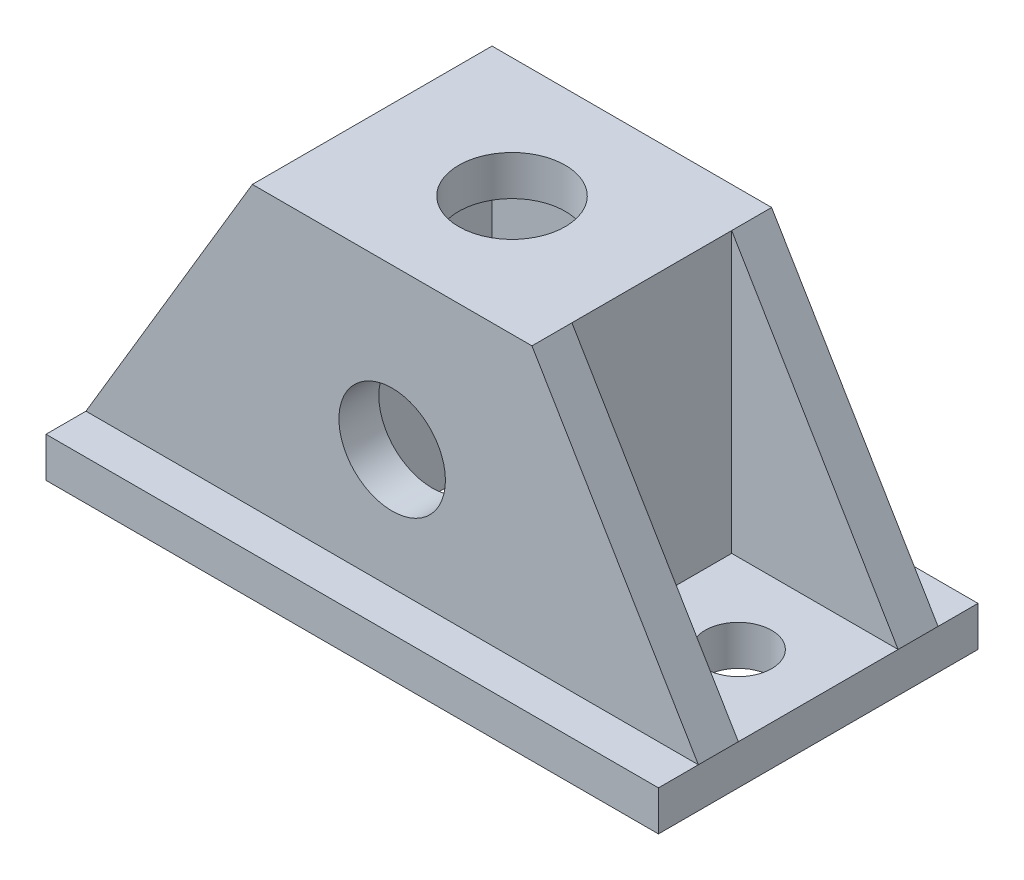
ISO-10303-21;
HEADER;
FILE_DESCRIPTION(('STEP AP214'),'2;1');
FILE_NAME('part.step','',(''),(''),'','','');
FILE_SCHEMA(('AUTOMOTIVE_DESIGN { 1 0 10303 214 1 1 1 1 }'));
ENDSEC;
DATA;
#1=APPLICATION_CONTEXT('core data for automotive mechanical design processes');
#2=APPLICATION_PROTOCOL_DEFINITION('international standard','automotive_design',2000,#1);
#3=PRODUCT_CONTEXT('',#1,'mechanical');
#4=PRODUCT('Part','Part','',(#3));
#5=PRODUCT_RELATED_PRODUCT_CATEGORY('part','',(#4));
#6=PRODUCT_DEFINITION_FORMATION('','',#4);
#7=PRODUCT_DEFINITION_CONTEXT('part definition',#1,'design');
#8=PRODUCT_DEFINITION('design','',#6,#7);
#9=PRODUCT_DEFINITION_SHAPE('','',#8);
#10=(LENGTH_UNIT() NAMED_UNIT(*) SI_UNIT(.MILLI.,.METRE.));
#11=(NAMED_UNIT(*) PLANE_ANGLE_UNIT() SI_UNIT($,.RADIAN.));
#12=(NAMED_UNIT(*) SI_UNIT($,.STERADIAN.) SOLID_ANGLE_UNIT());
#13=UNCERTAINTY_MEASURE_WITH_UNIT(LENGTH_MEASURE(1.E-05),#10,'distance_accuracy_value','');
#14=(GEOMETRIC_REPRESENTATION_CONTEXT(3) GLOBAL_UNCERTAINTY_ASSIGNED_CONTEXT((#13)) GLOBAL_UNIT_ASSIGNED_CONTEXT((#10,
#11,#12)) REPRESENTATION_CONTEXT('',''));
#15=CARTESIAN_POINT('',(0.,0.,0.));
#16=DIRECTION('',(0.,0.,1.));
#17=DIRECTION('',(1.,0.,0.));
#18=AXIS2_PLACEMENT_3D('',#15,#16,#17);
#19=CARTESIAN_POINT('',(-21.,42.,18.));
#20=DIRECTION('',(0.,0.,-1.));
#21=DIRECTION('',(-1.,0.,0.));
#22=AXIS2_PLACEMENT_3D('',#19,#20,#21);
#23=PLANE('',#22);
#24=DIRECTION('',(1.,0.,0.));
#25=VECTOR('',#24,1.);
#26=CARTESIAN_POINT('',(-21.,6.,18.));
#27=LINE('',#26,#25);
#28=CARTESIAN_POINT('',(-46.,6.,18.));
#29=VERTEX_POINT('',#28);
#30=CARTESIAN_POINT('',(46.,6.,18.));
#31=VERTEX_POINT('',#30);
#32=EDGE_CURVE('E223',#29,#31,#27,.T.);
#33=ORIENTED_EDGE('',*,*,#32,.T.);
#34=DIRECTION('',(-0.511483859767683,0.859292884409707,0.));
#35=VECTOR('',#34,1.);
#36=CARTESIAN_POINT('',(21.,48.,18.));
#37=LINE('',#36,#35);
#38=CARTESIAN_POINT('',(21.,48.,18.));
#39=VERTEX_POINT('',#38);
#40=EDGE_CURVE('E329',#31,#39,#37,.T.);
#41=ORIENTED_EDGE('',*,*,#40,.T.);
#42=DIRECTION('',(1.,0.,0.));
#43=VECTOR('',#42,1.);
#44=CARTESIAN_POINT('',(-21.,48.,18.));
#45=LINE('',#44,#43);
#46=CARTESIAN_POINT('',(-21.,48.,18.));
#47=VERTEX_POINT('',#46);
#48=EDGE_CURVE('E197',#47,#39,#45,.T.);
#49=ORIENTED_EDGE('',*,*,#48,.F.);
#50=DIRECTION('',(-0.511483859767683,-0.859292884409707,0.));
#51=VECTOR('',#50,1.);
#52=CARTESIAN_POINT('',(-21.,48.,18.));
#53=LINE('',#52,#51);
#54=EDGE_CURVE('E332',#47,#29,#53,.T.);
#55=ORIENTED_EDGE('',*,*,#54,.T.);
#56=EDGE_LOOP('',(#33,#41,#49,#55));
#57=FACE_BOUND('',#56,.T.);
#58=CARTESIAN_POINT('',(0.,24.,18.));
#59=DIRECTION('',(0.,0.,1.));
#60=DIRECTION('',(1.,0.,0.));
#61=AXIS2_PLACEMENT_3D('',#58,#59,#60);
#62=CIRCLE('',#61,8.);
#63=CARTESIAN_POINT('',(8.,24.,18.));
#64=VERTEX_POINT('',#63);
#65=EDGE_CURVE('E481',#64,#64,#62,.T.);
#66=ORIENTED_EDGE('',*,*,#65,.F.);
#67=EDGE_LOOP('',(#66));
#68=FACE_BOUND('',#67,.T.);
#69=ADVANCED_FACE('F37',(#57,#68),#23,.F.);
#70=CARTESIAN_POINT('',(0.,6.,0.));
#71=DIRECTION('',(0.,1.,0.));
#72=DIRECTION('',(0.,0.,1.));
#73=AXIS2_PLACEMENT_3D('',#70,#71,#72);
#74=PLANE('',#73);
#75=CARTESIAN_POINT('',(34.,6.,0.));
#76=DIRECTION('',(0.,1.,0.));
#77=DIRECTION('',(0.,0.,1.));
#78=AXIS2_PLACEMENT_3D('',#75,#76,#77);
#79=CIRCLE('',#78,5.);
#80=CARTESIAN_POINT('',(34.,6.,5.));
#81=VERTEX_POINT('',#80);
#82=EDGE_CURVE('E467',#81,#81,#79,.T.);
#83=ORIENTED_EDGE('',*,*,#82,.F.);
#84=EDGE_LOOP('',(#83));
#85=FACE_BOUND('',#84,.T.);
#86=DIRECTION('',(0.,0.,-1.));
#87=VECTOR('',#86,1.);
#88=CARTESIAN_POINT('',(46.,6.,-24.));
#89=LINE('',#88,#87);
#90=CARTESIAN_POINT('',(46.,6.,12.));
#91=VERTEX_POINT('',#90);
#92=CARTESIAN_POINT('',(46.,6.,-12.));
#93=VERTEX_POINT('',#92);
#94=EDGE_CURVE('E263',#91,#93,#89,.T.);
#95=ORIENTED_EDGE('',*,*,#94,.T.);
#96=DIRECTION('',(1.,0.,0.));
#97=VECTOR('',#96,1.);
#98=CARTESIAN_POINT('',(46.,6.,-12.));
#99=LINE('',#98,#97);
#100=CARTESIAN_POINT('',(21.,6.,-12.));
#101=VERTEX_POINT('',#100);
#102=EDGE_CURVE('E168',#101,#93,#99,.T.);
#103=ORIENTED_EDGE('',*,*,#102,.F.);
#104=DIRECTION('',(0.,0.,-1.));
#105=VECTOR('',#104,1.);
#106=CARTESIAN_POINT('',(21.,6.,-18.));
#107=LINE('',#106,#105);
#108=CARTESIAN_POINT('',(21.,6.,12.));
#109=VERTEX_POINT('',#108);
#110=EDGE_CURVE('E192',#109,#101,#107,.T.);
#111=ORIENTED_EDGE('',*,*,#110,.F.);
#112=DIRECTION('',(1.,0.,0.));
#113=VECTOR('',#112,1.);
#114=CARTESIAN_POINT('',(46.,6.,12.));
#115=LINE('',#114,#113);
#116=EDGE_CURVE('E313',#109,#91,#115,.T.);
#117=ORIENTED_EDGE('',*,*,#116,.T.);
#118=EDGE_LOOP('',(#95,#103,#111,#117));
#119=FACE_BOUND('',#118,.T.);
#120=ADVANCED_FACE('F312',(#85,#119),#74,.T.);
#121=CARTESIAN_POINT('',(21.,42.,-18.));
#122=DIRECTION('',(-1.,0.,0.));
#123=DIRECTION('',(0.,0.,1.));
#124=AXIS2_PLACEMENT_3D('',#121,#122,#123);
#125=PLANE('',#124);
#126=DIRECTION('',(0.,-1.,0.));
#127=VECTOR('',#126,1.);
#128=CARTESIAN_POINT('',(21.,6.,-12.));
#129=LINE('',#128,#127);
#130=CARTESIAN_POINT('',(21.,48.,-12.));
#131=VERTEX_POINT('',#130);
#132=EDGE_CURVE('E166',#131,#101,#129,.T.);
#133=ORIENTED_EDGE('',*,*,#132,.F.);
#134=DIRECTION('',(0.,0.,-1.));
#135=VECTOR('',#134,1.);
#136=CARTESIAN_POINT('',(21.,48.,18.));
#137=LINE('',#136,#135);
#138=CARTESIAN_POINT('',(21.,48.,12.));
#139=VERTEX_POINT('',#138);
#140=EDGE_CURVE('E189',#139,#131,#137,.T.);
#141=ORIENTED_EDGE('',*,*,#140,.F.);
#142=DIRECTION('',(0.,-1.,0.));
#143=VECTOR('',#142,1.);
#144=CARTESIAN_POINT('',(21.,6.,12.));
#145=LINE('',#144,#143);
#146=EDGE_CURVE('E333',#139,#109,#145,.T.);
#147=ORIENTED_EDGE('',*,*,#146,.T.);
#148=ORIENTED_EDGE('',*,*,#110,.T.);
#149=EDGE_LOOP('',(#133,#141,#147,#148));
#150=FACE_BOUND('',#149,.T.);
#151=ADVANCED_FACE('F187',(#150),#125,.F.);
#152=DIRECTION('',(-1.,0.,0.));
#153=VECTOR('',#152,1.);
#154=CARTESIAN_POINT('',(-21.,6.,-18.));
#155=LINE('',#154,#153);
#156=CARTESIAN_POINT('',(46.,6.,-18.));
#157=VERTEX_POINT('',#156);
#158=CARTESIAN_POINT('',(-46.,6.,-18.));
#159=VERTEX_POINT('',#158);
#160=EDGE_CURVE('E226',#157,#159,#155,.T.);
#161=ORIENTED_EDGE('',*,*,#160,.F.);
#162=CARTESIAN_POINT('',(46.,6.,-24.));
#163=VERTEX_POINT('',#162);
#164=EDGE_CURVE('E258',#157,#163,#89,.T.);
#165=ORIENTED_EDGE('',*,*,#164,.T.);
#166=DIRECTION('',(-1.,0.,0.));
#167=VECTOR('',#166,1.);
#168=CARTESIAN_POINT('',(-46.,6.,-24.));
#169=LINE('',#168,#167);
#170=CARTESIAN_POINT('',(-46.,6.,-24.));
#171=VERTEX_POINT('',#170);
#172=EDGE_CURVE('E262',#163,#171,#169,.T.);
#173=ORIENTED_EDGE('',*,*,#172,.T.);
#174=DIRECTION('',(0.,0.,1.));
#175=VECTOR('',#174,1.);
#176=CARTESIAN_POINT('',(-46.,6.,-24.));
#177=LINE('',#176,#175);
#178=EDGE_CURVE('E251',#171,#159,#177,.T.);
#179=ORIENTED_EDGE('',*,*,#178,.T.);
#180=EDGE_LOOP('',(#161,#165,#173,#179));
#181=FACE_BOUND('',#180,.T.);
#182=ADVANCED_FACE('F306',(#181),#74,.T.);
#183=CARTESIAN_POINT('',(-34.,6.,0.));
#184=DIRECTION('',(0.,1.,0.));
#185=DIRECTION('',(0.,0.,1.));
#186=AXIS2_PLACEMENT_3D('',#183,#184,#185);
#187=CIRCLE('',#186,5.);
#188=CARTESIAN_POINT('',(-34.,6.,5.));
#189=VERTEX_POINT('',#188);
#190=EDGE_CURVE('E464',#189,#189,#187,.T.);
#191=ORIENTED_EDGE('',*,*,#190,.F.);
#192=EDGE_LOOP('',(#191));
#193=FACE_BOUND('',#192,.T.);
#194=DIRECTION('',(1.,0.,0.));
#195=VECTOR('',#194,1.);
#196=CARTESIAN_POINT('',(-46.,6.,-12.));
#197=LINE('',#196,#195);
#198=CARTESIAN_POINT('',(-46.,6.,-12.));
#199=VERTEX_POINT('',#198);
#200=CARTESIAN_POINT('',(-21.,6.,-12.));
#201=VERTEX_POINT('',#200);
#202=EDGE_CURVE('E323',#199,#201,#197,.T.);
#203=ORIENTED_EDGE('',*,*,#202,.F.);
#204=CARTESIAN_POINT('',(-46.,6.,12.));
#205=VERTEX_POINT('',#204);
#206=EDGE_CURVE('E255',#199,#205,#177,.T.);
#207=ORIENTED_EDGE('',*,*,#206,.T.);
#208=DIRECTION('',(1.,0.,0.));
#209=VECTOR('',#208,1.);
#210=CARTESIAN_POINT('',(-46.,6.,12.));
#211=LINE('',#210,#209);
#212=CARTESIAN_POINT('',(-21.,6.,12.));
#213=VERTEX_POINT('',#212);
#214=EDGE_CURVE('E343',#205,#213,#211,.T.);
#215=ORIENTED_EDGE('',*,*,#214,.T.);
#216=DIRECTION('',(0.,0.,1.));
#217=VECTOR('',#216,1.);
#218=CARTESIAN_POINT('',(-21.,6.,-18.));
#219=LINE('',#218,#217);
#220=EDGE_CURVE('E221',#201,#213,#219,.T.);
#221=ORIENTED_EDGE('',*,*,#220,.F.);
#222=EDGE_LOOP('',(#203,#207,#215,#221));
#223=FACE_BOUND('',#222,.T.);
#224=ADVANCED_FACE('F409',(#193,#223),#74,.T.);
#225=CARTESIAN_POINT('',(46.,6.,24.));
#226=VERTEX_POINT('',#225);
#227=EDGE_CURVE('E259',#226,#31,#89,.T.);
#228=ORIENTED_EDGE('',*,*,#227,.T.);
#229=ORIENTED_EDGE('',*,*,#32,.F.);
#230=CARTESIAN_POINT('',(-46.,6.,24.));
#231=VERTEX_POINT('',#230);
#232=EDGE_CURVE('E256',#29,#231,#177,.T.);
#233=ORIENTED_EDGE('',*,*,#232,.T.);
#234=DIRECTION('',(1.,0.,0.));
#235=VECTOR('',#234,1.);
#236=CARTESIAN_POINT('',(-46.,6.,24.));
#237=LINE('',#236,#235);
#238=EDGE_CURVE('E254',#231,#226,#237,.T.);
#239=ORIENTED_EDGE('',*,*,#238,.T.);
#240=EDGE_LOOP('',(#228,#229,#233,#239));
#241=FACE_BOUND('',#240,.T.);
#242=ADVANCED_FACE('F383',(#241),#74,.T.);
#243=CARTESIAN_POINT('',(0.,0.,0.));
#244=DIRECTION('',(0.,1.,0.));
#245=DIRECTION('',(0.,0.,1.));
#246=AXIS2_PLACEMENT_3D('',#243,#244,#245);
#247=PLANE('',#246);
#248=CARTESIAN_POINT('',(-34.,0.,0.));
#249=DIRECTION('',(0.,1.,0.));
#250=DIRECTION('',(0.,0.,1.));
#251=AXIS2_PLACEMENT_3D('',#248,#249,#250);
#252=CIRCLE('',#251,5.);
#253=CARTESIAN_POINT('',(-34.,0.,5.));
#254=VERTEX_POINT('',#253);
#255=EDGE_CURVE('E461',#254,#254,#252,.T.);
#256=ORIENTED_EDGE('',*,*,#255,.T.);
#257=EDGE_LOOP('',(#256));
#258=FACE_BOUND('',#257,.T.);
#259=CARTESIAN_POINT('',(34.,0.,0.));
#260=DIRECTION('',(0.,1.,0.));
#261=DIRECTION('',(0.,0.,1.));
#262=AXIS2_PLACEMENT_3D('',#259,#260,#261);
#263=CIRCLE('',#262,5.);
#264=CARTESIAN_POINT('',(34.,0.,5.));
#265=VERTEX_POINT('',#264);
#266=EDGE_CURVE('E472',#265,#265,#263,.T.);
#267=ORIENTED_EDGE('',*,*,#266,.T.);
#268=EDGE_LOOP('',(#267));
#269=FACE_BOUND('',#268,.T.);
#270=DIRECTION('',(0.,0.,1.));
#271=VECTOR('',#270,1.);
#272=CARTESIAN_POINT('',(-46.,0.,-24.));
#273=LINE('',#272,#271);
#274=CARTESIAN_POINT('',(-46.,0.,-24.));
#275=VERTEX_POINT('',#274);
#276=CARTESIAN_POINT('',(-46.,0.,24.));
#277=VERTEX_POINT('',#276);
#278=EDGE_CURVE('E250',#275,#277,#273,.T.);
#279=ORIENTED_EDGE('',*,*,#278,.F.);
#280=DIRECTION('',(-1.,0.,0.));
#281=VECTOR('',#280,1.);
#282=CARTESIAN_POINT('',(-46.,0.,-24.));
#283=LINE('',#282,#281);
#284=CARTESIAN_POINT('',(46.,0.,-24.));
#285=VERTEX_POINT('',#284);
#286=EDGE_CURVE('E272',#285,#275,#283,.T.);
#287=ORIENTED_EDGE('',*,*,#286,.F.);
#288=DIRECTION('',(0.,0.,-1.));
#289=VECTOR('',#288,1.);
#290=CARTESIAN_POINT('',(46.,0.,-24.));
#291=LINE('',#290,#289);
#292=CARTESIAN_POINT('',(46.,0.,24.));
#293=VERTEX_POINT('',#292);
#294=EDGE_CURVE('E270',#293,#285,#291,.T.);
#295=ORIENTED_EDGE('',*,*,#294,.F.);
#296=DIRECTION('',(1.,0.,0.));
#297=VECTOR('',#296,1.);
#298=CARTESIAN_POINT('',(-46.,0.,24.));
#299=LINE('',#298,#297);
#300=EDGE_CURVE('E268',#277,#293,#299,.T.);
#301=ORIENTED_EDGE('',*,*,#300,.F.);
#302=EDGE_LOOP('',(#279,#287,#295,#301));
#303=FACE_BOUND('',#302,.T.);
#304=DIRECTION('',(0.,0.,1.));
#305=VECTOR('',#304,1.);
#306=CARTESIAN_POINT('',(-15.,0.,-12.));
#307=LINE('',#306,#305);
#308=CARTESIAN_POINT('',(-15.,0.,-12.));
#309=VERTEX_POINT('',#308);
#310=CARTESIAN_POINT('',(-15.,0.,12.));
#311=VERTEX_POINT('',#310);
#312=EDGE_CURVE('E228',#309,#311,#307,.T.);
#313=ORIENTED_EDGE('',*,*,#312,.T.);
#314=DIRECTION('',(1.,0.,0.));
#315=VECTOR('',#314,1.);
#316=CARTESIAN_POINT('',(-15.,0.,12.));
#317=LINE('',#316,#315);
#318=CARTESIAN_POINT('',(15.,0.,12.));
#319=VERTEX_POINT('',#318);
#320=EDGE_CURVE('E231',#311,#319,#317,.T.);
#321=ORIENTED_EDGE('',*,*,#320,.T.);
#322=DIRECTION('',(0.,0.,-1.));
#323=VECTOR('',#322,1.);
#324=CARTESIAN_POINT('',(15.,0.,-12.));
#325=LINE('',#324,#323);
#326=CARTESIAN_POINT('',(15.,0.,-12.));
#327=VERTEX_POINT('',#326);
#328=EDGE_CURVE('E234',#319,#327,#325,.T.);
#329=ORIENTED_EDGE('',*,*,#328,.T.);
#330=DIRECTION('',(-1.,0.,0.));
#331=VECTOR('',#330,1.);
#332=CARTESIAN_POINT('',(-15.,0.,-12.));
#333=LINE('',#332,#331);
#334=EDGE_CURVE('E237',#327,#309,#333,.T.);
#335=ORIENTED_EDGE('',*,*,#334,.T.);
#336=EDGE_LOOP('',(#313,#321,#329,#335));
#337=FACE_BOUND('',#336,.T.);
#338=ADVANCED_FACE('F292',(#258,#269,#303,#337),#247,.F.);
#339=CARTESIAN_POINT('',(-46.,6.,-24.));
#340=DIRECTION('',(1.,0.,0.));
#341=DIRECTION('',(0.,0.,-1.));
#342=AXIS2_PLACEMENT_3D('',#339,#340,#341);
#343=PLANE('',#342);
#344=ORIENTED_EDGE('',*,*,#278,.T.);
#345=DIRECTION('',(0.,-1.,0.));
#346=VECTOR('',#345,1.);
#347=CARTESIAN_POINT('',(-46.,6.,24.));
#348=LINE('',#347,#346);
#349=EDGE_CURVE('E11',#231,#277,#348,.T.);
#350=ORIENTED_EDGE('',*,*,#349,.F.);
#351=ORIENTED_EDGE('',*,*,#232,.F.);
#352=DIRECTION('',(0.,0.,1.));
#353=VECTOR('',#352,1.);
#354=CARTESIAN_POINT('',(-46.,6.,12.));
#355=LINE('',#354,#353);
#356=EDGE_CURVE('E200',#205,#29,#355,.T.);
#357=ORIENTED_EDGE('',*,*,#356,.F.);
#358=ORIENTED_EDGE('',*,*,#206,.F.);
#359=DIRECTION('',(0.,0.,-1.));
#360=VECTOR('',#359,1.);
#361=CARTESIAN_POINT('',(-46.,6.,-12.));
#362=LINE('',#361,#360);
#363=EDGE_CURVE('E304',#199,#159,#362,.T.);
#364=ORIENTED_EDGE('',*,*,#363,.T.);
#365=ORIENTED_EDGE('',*,*,#178,.F.);
#366=DIRECTION('',(0.,-1.,0.));
#367=VECTOR('',#366,1.);
#368=CARTESIAN_POINT('',(-46.,6.,-24.));
#369=LINE('',#368,#367);
#370=EDGE_CURVE('E265',#171,#275,#369,.T.);
#371=ORIENTED_EDGE('',*,*,#370,.T.);
#372=EDGE_LOOP('',(#344,#350,#351,#357,#358,#364,#365,#371));
#373=FACE_BOUND('',#372,.T.);
#374=ADVANCED_FACE('F39',(#373),#343,.F.);
#375=CARTESIAN_POINT('',(-46.,6.,24.));
#376=DIRECTION('',(0.,0.,-1.));
#377=DIRECTION('',(-1.,0.,0.));
#378=AXIS2_PLACEMENT_3D('',#375,#376,#377);
#379=PLANE('',#378);
#380=ORIENTED_EDGE('',*,*,#300,.T.);
#381=DIRECTION('',(0.,-1.,0.));
#382=VECTOR('',#381,1.);
#383=CARTESIAN_POINT('',(46.,6.,24.));
#384=LINE('',#383,#382);
#385=EDGE_CURVE('E46',#226,#293,#384,.T.);
#386=ORIENTED_EDGE('',*,*,#385,.F.);
#387=ORIENTED_EDGE('',*,*,#238,.F.);
#388=ORIENTED_EDGE('',*,*,#349,.T.);
#389=EDGE_LOOP('',(#380,#386,#387,#388));
#390=FACE_BOUND('',#389,.T.);
#391=ADVANCED_FACE('F417',(#390),#379,.F.);
#392=CARTESIAN_POINT('',(46.,6.,-24.));
#393=DIRECTION('',(-1.,0.,0.));
#394=DIRECTION('',(0.,0.,1.));
#395=AXIS2_PLACEMENT_3D('',#392,#393,#394);
#396=PLANE('',#395);
#397=ORIENTED_EDGE('',*,*,#294,.T.);
#398=DIRECTION('',(0.,-1.,0.));
#399=VECTOR('',#398,1.);
#400=CARTESIAN_POINT('',(46.,6.,-24.));
#401=LINE('',#400,#399);
#402=EDGE_CURVE('E276',#163,#285,#401,.T.);
#403=ORIENTED_EDGE('',*,*,#402,.F.);
#404=ORIENTED_EDGE('',*,*,#164,.F.);
#405=DIRECTION('',(0.,0.,-1.));
#406=VECTOR('',#405,1.);
#407=CARTESIAN_POINT('',(46.,6.,-12.));
#408=LINE('',#407,#406);
#409=EDGE_CURVE('E182',#93,#157,#408,.T.);
#410=ORIENTED_EDGE('',*,*,#409,.F.);
#411=ORIENTED_EDGE('',*,*,#94,.F.);
#412=DIRECTION('',(0.,0.,1.));
#413=VECTOR('',#412,1.);
#414=CARTESIAN_POINT('',(46.,6.,12.));
#415=LINE('',#414,#413);
#416=EDGE_CURVE('E314',#91,#31,#415,.T.);
#417=ORIENTED_EDGE('',*,*,#416,.T.);
#418=ORIENTED_EDGE('',*,*,#227,.F.);
#419=ORIENTED_EDGE('',*,*,#385,.T.);
#420=EDGE_LOOP('',(#397,#403,#404,#410,#411,#417,#418,#419));
#421=FACE_BOUND('',#420,.T.);
#422=ADVANCED_FACE('F284',(#421),#396,.F.);
#423=CARTESIAN_POINT('',(-46.,6.,-24.));
#424=DIRECTION('',(0.,0.,1.));
#425=DIRECTION('',(1.,0.,0.));
#426=AXIS2_PLACEMENT_3D('',#423,#424,#425);
#427=PLANE('',#426);
#428=ORIENTED_EDGE('',*,*,#286,.T.);
#429=ORIENTED_EDGE('',*,*,#370,.F.);
#430=ORIENTED_EDGE('',*,*,#172,.F.);
#431=ORIENTED_EDGE('',*,*,#402,.T.);
#432=EDGE_LOOP('',(#428,#429,#430,#431));
#433=FACE_BOUND('',#432,.T.);
#434=ADVANCED_FACE('F296',(#433),#427,.F.);
#435=CARTESIAN_POINT('',(-15.,6.,-12.));
#436=DIRECTION('',(1.,0.,0.));
#437=DIRECTION('',(0.,0.,-1.));
#438=AXIS2_PLACEMENT_3D('',#435,#436,#437);
#439=PLANE('',#438);
#440=ORIENTED_EDGE('',*,*,#312,.F.);
#441=DIRECTION('',(0.,-1.,0.));
#442=VECTOR('',#441,1.);
#443=CARTESIAN_POINT('',(-15.,6.,-12.));
#444=LINE('',#443,#442);
#445=CARTESIAN_POINT('',(-15.,42.,-12.));
#446=VERTEX_POINT('',#445);
#447=EDGE_CURVE('E240',#446,#309,#444,.T.);
#448=ORIENTED_EDGE('',*,*,#447,.F.);
#449=DIRECTION('',(0.,0.,1.));
#450=VECTOR('',#449,1.);
#451=CARTESIAN_POINT('',(-15.,42.,-12.));
#452=LINE('',#451,#450);
#453=CARTESIAN_POINT('',(-15.,42.,12.));
#454=VERTEX_POINT('',#453);
#455=EDGE_CURVE('E218',#446,#454,#452,.T.);
#456=ORIENTED_EDGE('',*,*,#455,.T.);
#457=DIRECTION('',(0.,-1.,0.));
#458=VECTOR('',#457,1.);
#459=CARTESIAN_POINT('',(-15.,6.,12.));
#460=LINE('',#459,#458);
#461=EDGE_CURVE('E247',#454,#311,#460,.T.);
#462=ORIENTED_EDGE('',*,*,#461,.T.);
#463=EDGE_LOOP('',(#440,#448,#456,#462));
#464=FACE_BOUND('',#463,.T.);
#465=ADVANCED_FACE('F403',(#464),#439,.T.);
#466=CARTESIAN_POINT('',(-15.,6.,12.));
#467=DIRECTION('',(0.,0.,-1.));
#468=DIRECTION('',(-1.,0.,0.));
#469=AXIS2_PLACEMENT_3D('',#466,#467,#468);
#470=PLANE('',#469);
#471=CARTESIAN_POINT('',(0.,24.,12.));
#472=DIRECTION('',(0.,0.,-1.));
#473=DIRECTION('',(-1.,0.,0.));
#474=AXIS2_PLACEMENT_3D('',#471,#472,#473);
#475=CIRCLE('',#474,8.);
#476=CARTESIAN_POINT('',(-8.,24.,12.));
#477=VERTEX_POINT('',#476);
#478=EDGE_CURVE('E484',#477,#477,#475,.T.);
#479=ORIENTED_EDGE('',*,*,#478,.F.);
#480=EDGE_LOOP('',(#479));
#481=FACE_BOUND('',#480,.T.);
#482=ORIENTED_EDGE('',*,*,#320,.F.);
#483=ORIENTED_EDGE('',*,*,#461,.F.);
#484=DIRECTION('',(1.,0.,0.));
#485=VECTOR('',#484,1.);
#486=CARTESIAN_POINT('',(-15.,42.,12.));
#487=LINE('',#486,#485);
#488=CARTESIAN_POINT('',(15.,42.,12.));
#489=VERTEX_POINT('',#488);
#490=EDGE_CURVE('E209',#454,#489,#487,.T.);
#491=ORIENTED_EDGE('',*,*,#490,.T.);
#492=DIRECTION('',(0.,-1.,0.));
#493=VECTOR('',#492,1.);
#494=CARTESIAN_POINT('',(15.,6.,12.));
#495=LINE('',#494,#493);
#496=EDGE_CURVE('E245',#489,#319,#495,.T.);
#497=ORIENTED_EDGE('',*,*,#496,.T.);
#498=EDGE_LOOP('',(#482,#483,#491,#497));
#499=FACE_BOUND('',#498,.T.);
#500=ADVANCED_FACE('F399',(#481,#499),#470,.T.);
#501=CARTESIAN_POINT('',(15.,6.,-12.));
#502=DIRECTION('',(-1.,0.,0.));
#503=DIRECTION('',(0.,0.,1.));
#504=AXIS2_PLACEMENT_3D('',#501,#502,#503);
#505=PLANE('',#504);
#506=ORIENTED_EDGE('',*,*,#328,.F.);
#507=ORIENTED_EDGE('',*,*,#496,.F.);
#508=DIRECTION('',(0.,0.,-1.));
#509=VECTOR('',#508,1.);
#510=CARTESIAN_POINT('',(15.,42.,12.));
#511=LINE('',#510,#509);
#512=CARTESIAN_POINT('',(15.,42.,-12.));
#513=VERTEX_POINT('',#512);
#514=EDGE_CURVE('E212',#489,#513,#511,.T.);
#515=ORIENTED_EDGE('',*,*,#514,.T.);
#516=DIRECTION('',(0.,-1.,0.));
#517=VECTOR('',#516,1.);
#518=CARTESIAN_POINT('',(15.,6.,-12.));
#519=LINE('',#518,#517);
#520=EDGE_CURVE('E243',#513,#327,#519,.T.);
#521=ORIENTED_EDGE('',*,*,#520,.T.);
#522=EDGE_LOOP('',(#506,#507,#515,#521));
#523=FACE_BOUND('',#522,.T.);
#524=ADVANCED_FACE('F395',(#523),#505,.T.);
#525=CARTESIAN_POINT('',(-15.,6.,-12.));
#526=DIRECTION('',(0.,0.,1.));
#527=DIRECTION('',(1.,0.,0.));
#528=AXIS2_PLACEMENT_3D('',#525,#526,#527);
#529=PLANE('',#528);
#530=CARTESIAN_POINT('',(0.,24.,-12.));
#531=DIRECTION('',(0.,0.,1.));
#532=DIRECTION('',(1.,0.,0.));
#533=AXIS2_PLACEMENT_3D('',#530,#531,#532);
#534=CIRCLE('',#533,8.);
#535=CARTESIAN_POINT('',(8.,24.,-12.));
#536=VERTEX_POINT('',#535);
#537=EDGE_CURVE('E487',#536,#536,#534,.T.);
#538=ORIENTED_EDGE('',*,*,#537,.F.);
#539=EDGE_LOOP('',(#538));
#540=FACE_BOUND('',#539,.T.);
#541=ORIENTED_EDGE('',*,*,#334,.F.);
#542=ORIENTED_EDGE('',*,*,#520,.F.);
#543=DIRECTION('',(-1.,0.,0.));
#544=VECTOR('',#543,1.);
#545=CARTESIAN_POINT('',(15.,42.,-12.));
#546=LINE('',#545,#544);
#547=EDGE_CURVE('E215',#513,#446,#546,.T.);
#548=ORIENTED_EDGE('',*,*,#547,.T.);
#549=ORIENTED_EDGE('',*,*,#447,.T.);
#550=EDGE_LOOP('',(#541,#542,#548,#549));
#551=FACE_BOUND('',#550,.T.);
#552=ADVANCED_FACE('F391',(#540,#551),#529,.T.);
#553=CARTESIAN_POINT('',(-21.,42.,-18.));
#554=DIRECTION('',(1.,0.,0.));
#555=DIRECTION('',(0.,0.,-1.));
#556=AXIS2_PLACEMENT_3D('',#553,#554,#555);
#557=PLANE('',#556);
#558=DIRECTION('',(0.,0.,1.));
#559=VECTOR('',#558,1.);
#560=CARTESIAN_POINT('',(-21.,48.,-18.));
#561=LINE('',#560,#559);
#562=CARTESIAN_POINT('',(-21.,48.,-12.));
#563=VERTEX_POINT('',#562);
#564=CARTESIAN_POINT('',(-21.,48.,12.));
#565=VERTEX_POINT('',#564);
#566=EDGE_CURVE('E205',#563,#565,#561,.T.);
#567=ORIENTED_EDGE('',*,*,#566,.F.);
#568=DIRECTION('',(0.,1.,0.));
#569=VECTOR('',#568,1.);
#570=CARTESIAN_POINT('',(-21.,6.,-12.));
#571=LINE('',#570,#569);
#572=EDGE_CURVE('E53',#201,#563,#571,.T.);
#573=ORIENTED_EDGE('',*,*,#572,.F.);
#574=ORIENTED_EDGE('',*,*,#220,.T.);
#575=DIRECTION('',(0.,1.,0.));
#576=VECTOR('',#575,1.);
#577=CARTESIAN_POINT('',(-21.,6.,12.));
#578=LINE('',#577,#576);
#579=EDGE_CURVE('E337',#213,#565,#578,.T.);
#580=ORIENTED_EDGE('',*,*,#579,.T.);
#581=EDGE_LOOP('',(#567,#573,#574,#580));
#582=FACE_BOUND('',#581,.T.);
#583=ADVANCED_FACE('F387',(#582),#557,.F.);
#584=CARTESIAN_POINT('',(-21.,42.,-18.));
#585=DIRECTION('',(0.,0.,1.));
#586=DIRECTION('',(1.,0.,0.));
#587=AXIS2_PLACEMENT_3D('',#584,#585,#586);
#588=PLANE('',#587);
#589=CARTESIAN_POINT('',(0.,24.,-18.));
#590=DIRECTION('',(0.,0.,1.));
#591=DIRECTION('',(1.,0.,0.));
#592=AXIS2_PLACEMENT_3D('',#589,#590,#591);
#593=CIRCLE('',#592,8.);
#594=CARTESIAN_POINT('',(8.,24.,-18.));
#595=VERTEX_POINT('',#594);
#596=EDGE_CURVE('E41',#595,#595,#593,.T.);
#597=ORIENTED_EDGE('',*,*,#596,.T.);
#598=EDGE_LOOP('',(#597));
#599=FACE_BOUND('',#598,.T.);
#600=ORIENTED_EDGE('',*,*,#160,.T.);
#601=DIRECTION('',(-0.511483859767683,-0.859292884409707,0.));
#602=VECTOR('',#601,1.);
#603=CARTESIAN_POINT('',(-21.,48.,-18.));
#604=LINE('',#603,#602);
#605=CARTESIAN_POINT('',(-21.,48.,-18.));
#606=VERTEX_POINT('',#605);
#607=EDGE_CURVE('E315',#606,#159,#604,.T.);
#608=ORIENTED_EDGE('',*,*,#607,.F.);
#609=DIRECTION('',(-1.,0.,0.));
#610=VECTOR('',#609,1.);
#611=CARTESIAN_POINT('',(21.,48.,-18.));
#612=LINE('',#611,#610);
#613=CARTESIAN_POINT('',(21.,48.,-18.));
#614=VERTEX_POINT('',#613);
#615=EDGE_CURVE('E199',#614,#606,#612,.T.);
#616=ORIENTED_EDGE('',*,*,#615,.F.);
#617=DIRECTION('',(-0.511483859767683,0.859292884409707,0.));
#618=VECTOR('',#617,1.);
#619=CARTESIAN_POINT('',(21.,48.,-18.));
#620=LINE('',#619,#618);
#621=EDGE_CURVE('E177',#157,#614,#620,.T.);
#622=ORIENTED_EDGE('',*,*,#621,.F.);
#623=EDGE_LOOP('',(#600,#608,#616,#622));
#624=FACE_BOUND('',#623,.T.);
#625=ADVANCED_FACE('F390',(#599,#624),#588,.F.);
#626=CARTESIAN_POINT('',(0.,42.,0.));
#627=DIRECTION('',(0.,1.,0.));
#628=DIRECTION('',(0.,0.,1.));
#629=AXIS2_PLACEMENT_3D('',#626,#627,#628);
#630=PLANE('',#629);
#631=CARTESIAN_POINT('',(0.,42.,0.));
#632=DIRECTION('',(0.,1.,0.));
#633=DIRECTION('',(0.,0.,1.));
#634=AXIS2_PLACEMENT_3D('',#631,#632,#633);
#635=CIRCLE('',#634,7.99999999999999);
#636=CARTESIAN_POINT('',(0.,42.,7.99999999999999));
#637=VERTEX_POINT('',#636);
#638=EDGE_CURVE('E478',#637,#637,#635,.T.);
#639=ORIENTED_EDGE('',*,*,#638,.T.);
#640=EDGE_LOOP('',(#639));
#641=FACE_BOUND('',#640,.T.);
#642=ORIENTED_EDGE('',*,*,#514,.F.);
#643=ORIENTED_EDGE('',*,*,#490,.F.);
#644=ORIENTED_EDGE('',*,*,#455,.F.);
#645=ORIENTED_EDGE('',*,*,#547,.F.);
#646=EDGE_LOOP('',(#642,#643,#644,#645));
#647=FACE_BOUND('',#646,.T.);
#648=ADVANCED_FACE('F498',(#641,#647),#630,.F.);
#649=CARTESIAN_POINT('',(0.,48.,0.));
#650=DIRECTION('',(0.,1.,0.));
#651=DIRECTION('',(0.,0.,1.));
#652=AXIS2_PLACEMENT_3D('',#649,#650,#651);
#653=PLANE('',#652);
#654=CARTESIAN_POINT('',(0.,48.,0.));
#655=DIRECTION('',(0.,1.,0.));
#656=DIRECTION('',(0.,0.,1.));
#657=AXIS2_PLACEMENT_3D('',#654,#655,#656);
#658=CIRCLE('',#657,8.);
#659=CARTESIAN_POINT('',(0.,48.,8.));
#660=VERTEX_POINT('',#659);
#661=EDGE_CURVE('E475',#660,#660,#658,.T.);
#662=ORIENTED_EDGE('',*,*,#661,.F.);
#663=EDGE_LOOP('',(#662));
#664=FACE_BOUND('',#663,.T.);
#665=ORIENTED_EDGE('',*,*,#48,.T.);
#666=EDGE_CURVE('E196',#39,#139,#137,.T.);
#667=ORIENTED_EDGE('',*,*,#666,.T.);
#668=ORIENTED_EDGE('',*,*,#140,.T.);
#669=DIRECTION('',(0.,0.,-1.));
#670=VECTOR('',#669,1.);
#671=CARTESIAN_POINT('',(21.,48.,-12.));
#672=LINE('',#671,#670);
#673=EDGE_CURVE('E174',#131,#614,#672,.T.);
#674=ORIENTED_EDGE('',*,*,#673,.T.);
#675=ORIENTED_EDGE('',*,*,#615,.T.);
#676=EDGE_CURVE('E206',#606,#563,#561,.T.);
#677=ORIENTED_EDGE('',*,*,#676,.T.);
#678=ORIENTED_EDGE('',*,*,#566,.T.);
#679=DIRECTION('',(0.,0.,1.));
#680=VECTOR('',#679,1.);
#681=CARTESIAN_POINT('',(-21.,48.,12.));
#682=LINE('',#681,#680);
#683=EDGE_CURVE('E346',#565,#47,#682,.T.);
#684=ORIENTED_EDGE('',*,*,#683,.T.);
#685=EDGE_LOOP('',(#665,#667,#668,#674,#675,#677,#678,#684));
#686=FACE_BOUND('',#685,.T.);
#687=ADVANCED_FACE('F195',(#664,#686),#653,.T.);
#688=CARTESIAN_POINT('',(-21.,48.,12.));
#689=DIRECTION('',(-0.859292884409707,0.511483859767682,0.));
#690=DIRECTION('',(-0.511483859767683,-0.859292884409707,0.));
#691=AXIS2_PLACEMENT_3D('',#688,#689,#690);
#692=PLANE('',#691);
#693=ORIENTED_EDGE('',*,*,#54,.F.);
#694=ORIENTED_EDGE('',*,*,#683,.F.);
#695=DIRECTION('',(-0.511483859767683,-0.859292884409707,0.));
#696=VECTOR('',#695,1.);
#697=CARTESIAN_POINT('',(-21.,48.,12.));
#698=LINE('',#697,#696);
#699=EDGE_CURVE('E340',#565,#205,#698,.T.);
#700=ORIENTED_EDGE('',*,*,#699,.T.);
#701=ORIENTED_EDGE('',*,*,#356,.T.);
#702=EDGE_LOOP('',(#693,#694,#700,#701));
#703=FACE_BOUND('',#702,.T.);
#704=ADVANCED_FACE('F427',(#703),#692,.T.);
#705=CARTESIAN_POINT('',(0.,0.,12.));
#706=DIRECTION('',(0.,0.,-1.));
#707=DIRECTION('',(-1.,0.,0.));
#708=AXIS2_PLACEMENT_3D('',#705,#706,#707);
#709=PLANE('',#708);
#710=ORIENTED_EDGE('',*,*,#579,.F.);
#711=ORIENTED_EDGE('',*,*,#214,.F.);
#712=ORIENTED_EDGE('',*,*,#699,.F.);
#713=EDGE_LOOP('',(#710,#711,#712));
#714=FACE_BOUND('',#713,.T.);
#715=ADVANCED_FACE('F373',(#714),#709,.T.);
#716=CARTESIAN_POINT('',(21.,48.,12.));
#717=DIRECTION('',(0.859292884409707,0.511483859767682,0.));
#718=DIRECTION('',(-0.511483859767683,0.859292884409707,0.));
#719=AXIS2_PLACEMENT_3D('',#716,#717,#718);
#720=PLANE('',#719);
#721=ORIENTED_EDGE('',*,*,#40,.F.);
#722=ORIENTED_EDGE('',*,*,#416,.F.);
#723=DIRECTION('',(-0.511483859767683,0.859292884409707,0.));
#724=VECTOR('',#723,1.);
#725=CARTESIAN_POINT('',(21.,48.,12.));
#726=LINE('',#725,#724);
#727=EDGE_CURVE('E61',#91,#139,#726,.T.);
#728=ORIENTED_EDGE('',*,*,#727,.T.);
#729=ORIENTED_EDGE('',*,*,#666,.F.);
#730=EDGE_LOOP('',(#721,#722,#728,#729));
#731=FACE_BOUND('',#730,.T.);
#732=ADVANCED_FACE('F360',(#731),#720,.T.);
#733=CARTESIAN_POINT('',(0.,0.,12.));
#734=DIRECTION('',(0.,0.,1.));
#735=DIRECTION('',(1.,0.,0.));
#736=AXIS2_PLACEMENT_3D('',#733,#734,#735);
#737=PLANE('',#736);
#738=ORIENTED_EDGE('',*,*,#146,.F.);
#739=ORIENTED_EDGE('',*,*,#727,.F.);
#740=ORIENTED_EDGE('',*,*,#116,.F.);
#741=EDGE_LOOP('',(#738,#739,#740));
#742=FACE_BOUND('',#741,.T.);
#743=ADVANCED_FACE('F362',(#742),#737,.F.);
#744=CARTESIAN_POINT('',(-21.,48.,-12.));
#745=DIRECTION('',(0.859292884409707,-0.511483859767682,0.));
#746=DIRECTION('',(0.511483859767683,0.859292884409707,0.));
#747=AXIS2_PLACEMENT_3D('',#744,#745,#746);
#748=PLANE('',#747);
#749=ORIENTED_EDGE('',*,*,#607,.T.);
#750=ORIENTED_EDGE('',*,*,#363,.F.);
#751=DIRECTION('',(-0.511483859767683,-0.859292884409707,0.));
#752=VECTOR('',#751,1.);
#753=CARTESIAN_POINT('',(-21.,48.,-12.));
#754=LINE('',#753,#752);
#755=EDGE_CURVE('E325',#563,#199,#754,.T.);
#756=ORIENTED_EDGE('',*,*,#755,.F.);
#757=ORIENTED_EDGE('',*,*,#676,.F.);
#758=EDGE_LOOP('',(#749,#750,#756,#757));
#759=FACE_BOUND('',#758,.T.);
#760=ADVANCED_FACE('F364',(#759),#748,.F.);
#761=CARTESIAN_POINT('',(0.,0.,-12.));
#762=DIRECTION('',(0.,0.,1.));
#763=DIRECTION('',(-1.,0.,0.));
#764=AXIS2_PLACEMENT_3D('',#761,#762,#763);
#765=PLANE('',#764);
#766=ORIENTED_EDGE('',*,*,#572,.T.);
#767=ORIENTED_EDGE('',*,*,#755,.T.);
#768=ORIENTED_EDGE('',*,*,#202,.T.);
#769=EDGE_LOOP('',(#766,#767,#768));
#770=FACE_BOUND('',#769,.T.);
#771=ADVANCED_FACE('F370',(#770),#765,.T.);
#772=CARTESIAN_POINT('',(21.,48.,-12.));
#773=DIRECTION('',(-0.859292884409707,-0.511483859767682,0.));
#774=DIRECTION('',(0.511483859767683,-0.859292884409707,0.));
#775=AXIS2_PLACEMENT_3D('',#772,#773,#774);
#776=PLANE('',#775);
#777=ORIENTED_EDGE('',*,*,#621,.T.);
#778=ORIENTED_EDGE('',*,*,#673,.F.);
#779=DIRECTION('',(-0.511483859767683,0.859292884409707,0.));
#780=VECTOR('',#779,1.);
#781=CARTESIAN_POINT('',(21.,48.,-12.));
#782=LINE('',#781,#780);
#783=EDGE_CURVE('E162',#93,#131,#782,.T.);
#784=ORIENTED_EDGE('',*,*,#783,.F.);
#785=ORIENTED_EDGE('',*,*,#409,.T.);
#786=EDGE_LOOP('',(#777,#778,#784,#785));
#787=FACE_BOUND('',#786,.T.);
#788=ADVANCED_FACE('F175',(#787),#776,.F.);
#789=CARTESIAN_POINT('',(0.,0.,-12.));
#790=DIRECTION('',(0.,0.,-1.));
#791=DIRECTION('',(1.,0.,0.));
#792=AXIS2_PLACEMENT_3D('',#789,#790,#791);
#793=PLANE('',#792);
#794=ORIENTED_EDGE('',*,*,#132,.T.);
#795=ORIENTED_EDGE('',*,*,#102,.T.);
#796=ORIENTED_EDGE('',*,*,#783,.T.);
#797=EDGE_LOOP('',(#794,#795,#796));
#798=FACE_BOUND('',#797,.T.);
#799=ADVANCED_FACE('F164',(#798),#793,.F.);
#800=CARTESIAN_POINT('',(0.,24.,18.));
#801=DIRECTION('',(0.,0.,1.));
#802=DIRECTION('',(1.,0.,0.));
#803=AXIS2_PLACEMENT_3D('',#800,#801,#802);
#804=CYLINDRICAL_SURFACE('',#803,8.);
#805=ORIENTED_EDGE('',*,*,#537,.T.);
#806=EDGE_LOOP('',(#805));
#807=FACE_BOUND('',#806,.T.);
#808=ORIENTED_EDGE('',*,*,#596,.F.);
#809=EDGE_LOOP('',(#808));
#810=FACE_BOUND('',#809,.T.);
#811=ADVANCED_FACE('F440',(#807,#810),#804,.F.);
#812=ORIENTED_EDGE('',*,*,#478,.T.);
#813=EDGE_LOOP('',(#812));
#814=FACE_BOUND('',#813,.T.);
#815=ORIENTED_EDGE('',*,*,#65,.T.);
#816=EDGE_LOOP('',(#815));
#817=FACE_BOUND('',#816,.T.);
#818=ADVANCED_FACE('F443',(#814,#817),#804,.F.);
#819=CARTESIAN_POINT('',(0.,48.,0.));
#820=DIRECTION('',(0.,1.,0.));
#821=DIRECTION('',(0.,0.,1.));
#822=AXIS2_PLACEMENT_3D('',#819,#820,#821);
#823=CYLINDRICAL_SURFACE('',#822,7.99999999999999);
#824=ORIENTED_EDGE('',*,*,#661,.T.);
#825=EDGE_LOOP('',(#824));
#826=FACE_BOUND('',#825,.T.);
#827=ORIENTED_EDGE('',*,*,#638,.F.);
#828=EDGE_LOOP('',(#827));
#829=FACE_BOUND('',#828,.T.);
#830=ADVANCED_FACE('F445',(#826,#829),#823,.F.);
#831=CARTESIAN_POINT('',(34.,6.,0.));
#832=DIRECTION('',(0.,1.,0.));
#833=DIRECTION('',(0.,0.,1.));
#834=AXIS2_PLACEMENT_3D('',#831,#832,#833);
#835=CYLINDRICAL_SURFACE('',#834,5.);
#836=ORIENTED_EDGE('',*,*,#266,.F.);
#837=EDGE_LOOP('',(#836));
#838=FACE_BOUND('',#837,.T.);
#839=ORIENTED_EDGE('',*,*,#82,.T.);
#840=EDGE_LOOP('',(#839));
#841=FACE_BOUND('',#840,.T.);
#842=ADVANCED_FACE('F448',(#838,#841),#835,.F.);
#843=CARTESIAN_POINT('',(-34.,6.,0.));
#844=DIRECTION('',(0.,1.,0.));
#845=DIRECTION('',(0.,0.,1.));
#846=AXIS2_PLACEMENT_3D('',#843,#844,#845);
#847=CYLINDRICAL_SURFACE('',#846,5.);
#848=ORIENTED_EDGE('',*,*,#255,.F.);
#849=EDGE_LOOP('',(#848));
#850=FACE_BOUND('',#849,.T.);
#851=ORIENTED_EDGE('',*,*,#190,.T.);
#852=EDGE_LOOP('',(#851));
#853=FACE_BOUND('',#852,.T.);
#854=ADVANCED_FACE('F452',(#850,#853),#847,.F.);
#855=CLOSED_SHELL('',(#69,#120,#151,#182,#224,#242,#338,#374,#391,#422,#434,#465,#500,#524,#552,
#583,#625,#648,#687,#704,#715,#732,#743,#760,#771,#788,#799,#811,#818,#830,#842,#854));
#856=MANIFOLD_SOLID_BREP('B2',#855);
#857=ADVANCED_BREP_SHAPE_REPRESENTATION('',(#18,#856),#14);
#858=SHAPE_DEFINITION_REPRESENTATION(#9,#857);
ENDSEC;
END-ISO-10303-21;
